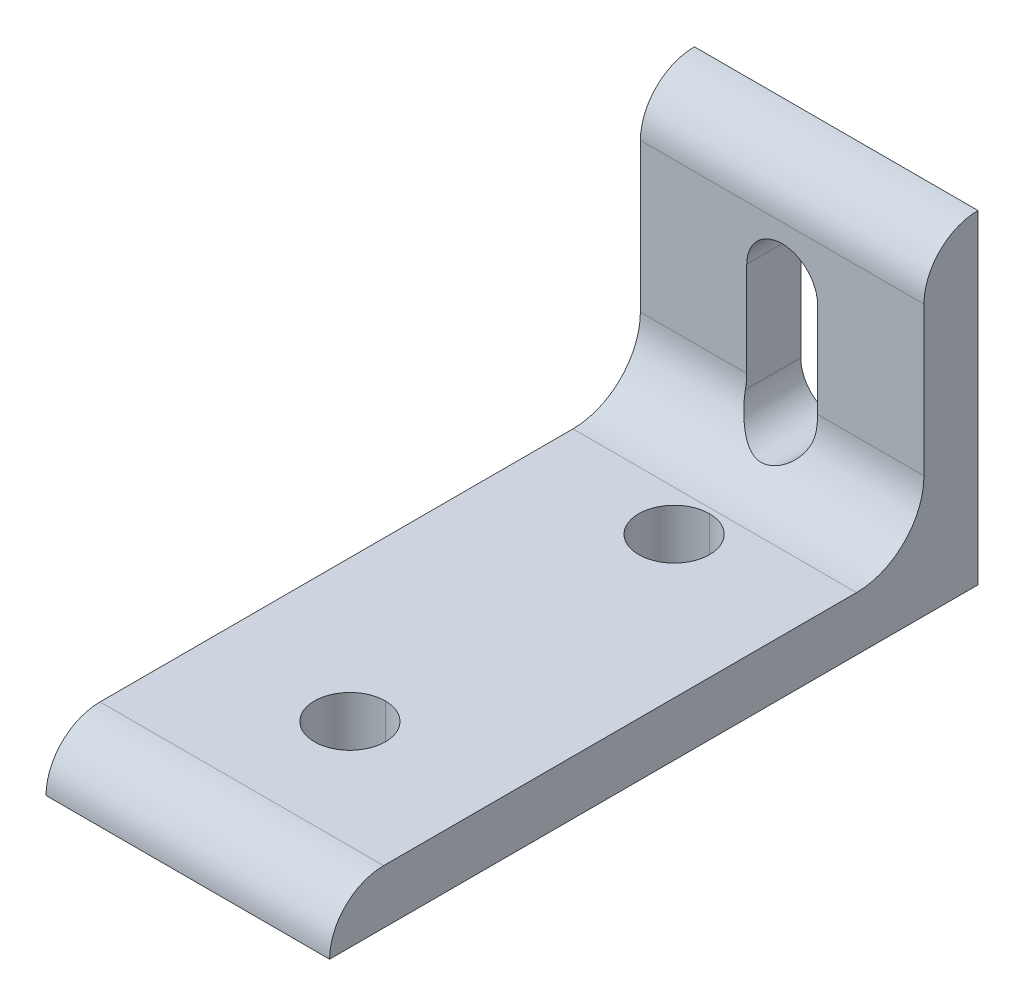
ISO-10303-21;
HEADER;
FILE_DESCRIPTION(('STEP AP214'),'2;1');
FILE_NAME('part.step','',(''),(''),'','','');
FILE_SCHEMA(('AUTOMOTIVE_DESIGN { 1 0 10303 214 1 1 1 1 }'));
ENDSEC;
DATA;
#1=APPLICATION_CONTEXT('core data for automotive mechanical design processes');
#2=APPLICATION_PROTOCOL_DEFINITION('international standard','automotive_design',2000,#1);
#3=PRODUCT_CONTEXT('',#1,'mechanical');
#4=PRODUCT('Part','Part','',(#3));
#5=PRODUCT_RELATED_PRODUCT_CATEGORY('part','',(#4));
#6=PRODUCT_DEFINITION_FORMATION('','',#4);
#7=PRODUCT_DEFINITION_CONTEXT('part definition',#1,'design');
#8=PRODUCT_DEFINITION('design','',#6,#7);
#9=PRODUCT_DEFINITION_SHAPE('','',#8);
#10=(LENGTH_UNIT() NAMED_UNIT(*) SI_UNIT(.MILLI.,.METRE.));
#11=(NAMED_UNIT(*) PLANE_ANGLE_UNIT() SI_UNIT($,.RADIAN.));
#12=(NAMED_UNIT(*) SI_UNIT($,.STERADIAN.) SOLID_ANGLE_UNIT());
#13=UNCERTAINTY_MEASURE_WITH_UNIT(LENGTH_MEASURE(1.E-05),#10,'distance_accuracy_value','');
#14=(GEOMETRIC_REPRESENTATION_CONTEXT(3) GLOBAL_UNCERTAINTY_ASSIGNED_CONTEXT((#13)) GLOBAL_UNIT_ASSIGNED_CONTEXT((#10,
#11,#12)) REPRESENTATION_CONTEXT('',''));
#15=CARTESIAN_POINT('',(0.,0.,0.));
#16=DIRECTION('',(0.,0.,1.));
#17=DIRECTION('',(1.,0.,0.));
#18=AXIS2_PLACEMENT_3D('',#15,#16,#17);
#19=CARTESIAN_POINT('',(16.6624,14.2748,14.2748));
#20=DIRECTION('',(-1.,0.,0.));
#21=DIRECTION('',(0.,0.707106781186548,0.707106781186548));
#22=AXIS2_PLACEMENT_3D('',#19,#20,#21);
#23=CYLINDRICAL_SURFACE('',#22,7.9248);
#24=CARTESIAN_POINT('',(4.1656,12.7,6.50804649547831));
#25=CARTESIAN_POINT('',(4.16559910068862,12.6483262510868,6.51852290068247));
#26=CARTESIAN_POINT('',(4.16460923845618,12.5967597649538,6.52951650766799));
#27=CARTESIAN_POINT('',(4.16070433576214,12.4937964106606,6.55254212415396));
#28=CARTESIAN_POINT('',(4.15778448578746,12.4424002894491,6.56457666236116));
#29=CARTESIAN_POINT('',(4.15006547902772,12.3398932292368,6.58965968324226));
#30=CARTESIAN_POINT('',(4.14526270378471,12.2887830326713,6.6027100791782));
#31=CARTESIAN_POINT('',(4.13382226612954,12.186959563482,6.62979143524392));
#32=CARTESIAN_POINT('',(4.12718226462334,12.1362468821698,6.64382362823445));
#33=CARTESIAN_POINT('',(4.1121120171003,12.0353285012999,6.67282785159898));
#34=CARTESIAN_POINT('',(4.10368077814917,11.9851230991784,6.68780039998305));
#35=CARTESIAN_POINT('',(4.08507272844787,11.8853265632392,6.7186370413421));
#36=CARTESIAN_POINT('',(4.07489631791151,11.8357352913747,6.73450092934986));
#37=CARTESIAN_POINT('',(4.05284185887812,11.7372716352314,6.76706459618152));
#38=CARTESIAN_POINT('',(4.04096563713014,11.6883985405308,6.78376346529353));
#39=CARTESIAN_POINT('',(4.01555812264469,11.5914718888298,6.81793466111083));
#40=CARTESIAN_POINT('',(4.00203010169491,11.5434169198518,6.83540541645101));
#41=CARTESIAN_POINT('',(3.97335543609489,11.4482260121035,6.87105025997871));
#42=CARTESIAN_POINT('',(3.95821353255274,11.4010878375251,6.88922219316665));
#43=CARTESIAN_POINT('',(3.92633012958023,11.3076555364116,6.92626045851652));
#44=CARTESIAN_POINT('',(3.90958922720121,11.2613611024608,6.94512652988853));
#45=CARTESIAN_POINT('',(3.874545258972,11.1695477047277,6.98354879843956));
#46=CARTESIAN_POINT('',(3.85623940489683,11.1240303059863,7.00310618937914));
#47=CARTESIAN_POINT('',(3.81811021919776,11.0338324168393,7.04285582753527));
#48=CARTESIAN_POINT('',(3.79828484226978,10.9891531589003,7.06304890808212));
#49=CARTESIAN_POINT('',(3.75716815330975,10.9006882759781,7.10401181625168));
#50=CARTESIAN_POINT('',(3.73587557524143,10.8569034661278,7.12478213250859));
#51=CARTESIAN_POINT('',(3.69187412500125,10.770281987965,7.16683775055717));
#52=CARTESIAN_POINT('',(3.66916477890621,10.7274456434865,7.18812322320068));
#53=CARTESIAN_POINT('',(3.62238002089509,10.6427725367516,7.23114426669175));
#54=CARTESIAN_POINT('',(3.59830493457038,10.6009355396032,7.25287972948388));
#55=CARTESIAN_POINT('',(3.54883839349804,10.5183098956977,7.29673272750984));
#56=CARTESIAN_POINT('',(3.52344806502744,10.4775203952949,7.318849925374));
#57=CARTESIAN_POINT('',(3.47140222787135,10.3970347361924,7.36339609373931));
#58=CARTESIAN_POINT('',(3.44474864062929,10.3573370535109,7.38582455623942));
#59=CARTESIAN_POINT('',(3.39022032802085,10.2790775590841,7.43092005267494));
#60=CARTESIAN_POINT('',(3.36234824187561,10.2405135681882,7.45358649734641));
#61=CARTESIAN_POINT('',(3.30535360370953,10.1644232387242,7.49916527845639));
#62=CARTESIAN_POINT('',(3.27623026332492,10.126897579586,7.52207776288898));
#63=CARTESIAN_POINT('',(3.21671980689949,10.0528521110899,7.56812306899885));
#64=CARTESIAN_POINT('',(3.18633033124268,10.0163344118377,7.59125623389117));
#65=CARTESIAN_POINT('',(3.12431600896386,9.94435081592525,7.63766948892534));
#66=CARTESIAN_POINT('',(3.09268951300134,9.90888644270178,7.66094973794245));
#67=CARTESIAN_POINT('',(3.02823169197178,9.83905120058719,7.70758202311579));
#68=CARTESIAN_POINT('',(2.995399389486,9.80468126293414,7.7309341027945));
#69=CARTESIAN_POINT('',(2.92855996665256,9.73707391479773,7.77763250954442));
#70=CARTESIAN_POINT('',(2.89455249636072,9.70383684761878,7.80097883278039));
#71=CARTESIAN_POINT('',(2.82539296749285,9.63853120752479,7.84758632215062));
#72=CARTESIAN_POINT('',(2.79024114025831,9.60646240117966,7.87084750445204));
#73=CARTESIAN_POINT('',(2.7188230361711,9.5435264998941,7.91720355548552));
#74=CARTESIAN_POINT('',(2.68255752252418,9.5126586134597,7.94029852529238));
#75=CARTESIAN_POINT('',(2.6089425952563,9.45215470914943,7.98623986070978));
#76=CARTESIAN_POINT('',(2.57159442301909,9.42251736835589,8.00908647272543));
#77=CARTESIAN_POINT('',(2.49584346311943,9.36450328045691,8.05444670963974));
#78=CARTESIAN_POINT('',(2.45744233882141,9.33612471174852,8.0769607820265));
#79=CARTESIAN_POINT('',(2.37961716666478,9.28064831258157,8.1215757643151));
#80=CARTESIAN_POINT('',(2.34019506153033,9.25354829206915,8.1436773383844));
#81=CARTESIAN_POINT('',(2.26020132275405,9.20057245436101,8.18744817404037));
#82=CARTESIAN_POINT('',(2.21962809450969,9.17469848267562,8.20911675718393));
#83=CARTESIAN_POINT('',(2.13728802570806,9.12418820790345,8.25194748304888));
#84=CARTESIAN_POINT('',(2.0955184407531,9.09955517996449,8.2731082155752));
#85=CARTESIAN_POINT('',(2.01083639254707,9.05159684581087,8.31479876507631));
#86=CARTESIAN_POINT('',(1.96792243834031,9.02827338223667,8.33532767556159));
#87=CARTESIAN_POINT('',(1.88100062797943,8.9830023088737,8.37562624809991));
#88=CARTESIAN_POINT('',(1.83699236616183,8.96105522025898,8.39539562146432));
#89=CARTESIAN_POINT('',(1.74793151905121,8.91860142434246,8.43404529460075));
#90=CARTESIAN_POINT('',(1.70287942766104,8.89809405360948,8.45292600253589));
#91=CARTESIAN_POINT('',(1.61178079043352,8.85858124938866,8.4896676372607));
#92=CARTESIAN_POINT('',(1.56573542710861,8.83957414323546,8.50752969341003));
#93=CARTESIAN_POINT('',(1.47269942511129,8.8031226664084,8.54210148239709));
#94=CARTESIAN_POINT('',(1.42571042390053,8.78567583419806,8.55881302038412));
#95=CARTESIAN_POINT('',(1.33084001601571,8.75239891861909,8.59095663470236));
#96=CARTESIAN_POINT('',(1.28296044109199,8.73656587492093,8.60639104363444));
#97=CARTESIAN_POINT('',(1.18626701188708,8.70656395118639,8.63585999931674));
#98=CARTESIAN_POINT('',(1.13745334326693,8.69239474435936,8.64989482087499));
#99=CARTESIAN_POINT('',(1.03877037576843,8.66576158539076,8.67645214157442));
#100=CARTESIAN_POINT('',(0.988898111408036,8.65330344800409,8.68896946766798));
#101=CARTESIAN_POINT('',(0.888272406566362,8.63013146038122,8.71238653212755));
#102=CARTESIAN_POINT('',(0.837517510437975,8.61942086984744,8.72328324428546));
#103=CARTESIAN_POINT('',(0.735299141684097,8.5998114977886,8.74333026850751));
#104=CARTESIAN_POINT('',(0.683835454138323,8.59091327932723,8.75248003778026));
#105=CARTESIAN_POINT('',(0.580376114788418,8.57499293169131,8.76891358589675));
#106=CARTESIAN_POINT('',(0.528381051430956,8.56796892064611,8.77619923617696));
#107=CARTESIAN_POINT('',(0.424035364870416,8.5558659359328,8.78878829695607));
#108=CARTESIAN_POINT('',(0.371685700038057,8.55078296758398,8.79409577799623));
#109=CARTESIAN_POINT('',(0.266797454367452,8.54263689718797,8.80261616136688));
#110=CARTESIAN_POINT('',(0.214259744020138,8.5395684686319,8.8058345869701));
#111=CARTESIAN_POINT('',(0.108930158217709,8.53551763121947,8.81008575263676));
#112=CARTESIAN_POINT('',(0.0561380086822987,8.53453861508933,8.81111493786739));
#113=CARTESIAN_POINT('',(-0.0495949605609174,8.53459357445839,8.81105723065727));
#114=CARTESIAN_POINT('',(-0.102535766697312,8.53563340524478,8.80996418307764));
#115=CARTESIAN_POINT('',(-0.208347322249661,8.53968773054371,8.80570949989556));
#116=CARTESIAN_POINT('',(-0.261217801206745,8.54270556606149,8.8025443643847));
#117=CARTESIAN_POINT('',(-0.366668340180755,8.55068067647249,8.79420274227102));
#118=CARTESIAN_POINT('',(-0.419248307137458,8.5556385399963,8.78902564521527));
#119=CARTESIAN_POINT('',(-0.523896820823398,8.56746631049866,8.77672126223338));
#120=CARTESIAN_POINT('',(-0.575965912137539,8.57433388286567,8.76959635767271));
#121=CARTESIAN_POINT('',(-0.679373069825542,8.58995638074271,8.75346554710628));
#122=CARTESIAN_POINT('',(-0.73071278606652,8.59870591850158,8.74446501295881));
#123=CARTESIAN_POINT('',(-0.832523307863322,8.61809927353439,8.72463039526984));
#124=CARTESIAN_POINT('',(-0.882996099642055,8.6287378650111,8.71380137393298));
#125=CARTESIAN_POINT('',(-0.983236251490251,8.65181563659448,8.69046726358006));
#126=CARTESIAN_POINT('',(-1.03300213460107,8.66425810973476,8.67795911242894));
#127=CARTESIAN_POINT('',(-1.13176093391308,8.69088148485623,8.65139684423846));
#128=CARTESIAN_POINT('',(-1.18075210284465,8.70506581787219,8.63733968180343));
#129=CARTESIAN_POINT('',(-1.27787732221295,8.73510058095985,8.60782290529264));
#130=CARTESIAN_POINT('',(-1.32600998096485,8.75095347143239,8.59236122489056));
#131=CARTESIAN_POINT('',(-1.42133317332004,8.784255474997,8.56017731703002));
#132=CARTESIAN_POINT('',(-1.46852300010586,8.80170573464978,8.54345418566561));
#133=CARTESIAN_POINT('',(-1.5618748660428,8.83813173016181,8.50888955095182));
#134=CARTESIAN_POINT('',(-1.60803719294482,8.85710703189165,8.49104836619185));
#135=CARTESIAN_POINT('',(-1.69924978383119,8.89650892563569,8.45439079745789));
#136=CARTESIAN_POINT('',(-1.7443016111633,8.91693329938536,8.43557591549413));
#137=CARTESIAN_POINT('',(-1.83320209487406,8.95916388711591,8.39710649246978));
#138=CARTESIAN_POINT('',(-1.87705386222272,8.9809659209396,8.3774545453187));
#139=CARTESIAN_POINT('',(-1.96363094326651,9.0259269907246,8.33740222083245));
#140=CARTESIAN_POINT('',(-2.00635749621461,9.04908443479573,8.31700273159426));
#141=CARTESIAN_POINT('',(-2.09082216870558,9.09676541372993,8.27551556129219));
#142=CARTESIAN_POINT('',(-2.13255831558851,9.12129139417706,8.25442667805237));
#143=CARTESIAN_POINT('',(-2.21500742924451,9.17168666266671,8.21165038874408));
#144=CARTESIAN_POINT('',(-2.25571864148252,9.19755804880204,8.18996207416265));
#145=CARTESIAN_POINT('',(-2.33609097852183,9.25061071371635,8.14608368816412));
#146=CARTESIAN_POINT('',(-2.37575069278334,9.27779362647569,8.1238930101381));
#147=CARTESIAN_POINT('',(-2.45399084888472,9.33343582933559,8.07910376924644));
#148=CARTESIAN_POINT('',(-2.49257032120512,9.36189620988127,8.05650486814539));
#149=CARTESIAN_POINT('',(-2.56862128857915,9.42005656316795,8.01099243198638));
#150=CARTESIAN_POINT('',(-2.60609234700774,9.44975701357257,7.98807877801187));
#151=CARTESIAN_POINT('',(-2.67989753257117,9.51035799937778,7.94202844917097));
#152=CARTESIAN_POINT('',(-2.71623183881969,9.54125834397847,7.91889181019861));
#153=CARTESIAN_POINT('',(-2.78773452340449,9.60421647975658,7.87248535783819));
#154=CARTESIAN_POINT('',(-2.82290377234515,9.63627336747611,7.84921565985857));
#155=CARTESIAN_POINT('',(-2.892047256023,9.70149873925947,7.80263077496292));
#156=CARTESIAN_POINT('',(-2.92602312273601,9.73466557365784,7.77931570017134));
#157=CARTESIAN_POINT('',(-2.99275068923808,9.80206156533931,7.73272536576135));
#158=CARTESIAN_POINT('',(-3.02550484784911,9.83628830327493,7.70945012741818));
#159=CARTESIAN_POINT('',(-3.08979988619321,9.90579498105089,7.66299276389463));
#160=CARTESIAN_POINT('',(-3.12134267053342,9.94107309850031,7.63981054856553));
#161=CARTESIAN_POINT('',(-3.18330262007488,10.012807833151,7.59350491461863));
#162=CARTESIAN_POINT('',(-3.21371719617037,10.0492668399351,7.57038173249746));
#163=CARTESIAN_POINT('',(-3.27338971954744,10.1233433945556,7.52426146205921));
#164=CARTESIAN_POINT('',(-3.30264527416552,10.160963080098,7.50126471121694));
#165=CARTESIAN_POINT('',(-3.35995127797596,10.2373272227098,7.4554706023357));
#166=CARTESIAN_POINT('',(-3.38800001973318,10.2760731513248,7.43267356094008));
#167=CARTESIAN_POINT('',(-3.44284497785957,10.3546524006964,7.38735078507675));
#168=CARTESIAN_POINT('',(-3.46964018778418,10.3944865558718,7.36482527903747));
#169=CARTESIAN_POINT('',(-3.52193035002835,10.4752021348307,7.32011524294332));
#170=CARTESIAN_POINT('',(-3.54742500761759,10.5160837928729,7.2979307909667));
#171=CARTESIAN_POINT('',(-3.59706643113914,10.5988512468828,7.25397021637245));
#172=CARTESIAN_POINT('',(-3.6212136217272,10.64073672048,7.23219396656266));
#173=CARTESIAN_POINT('',(-3.66811232456724,10.725465792904,7.18911453336947));
#174=CARTESIAN_POINT('',(-3.69086498433196,10.7683085632834,7.16781097049451));
#175=CARTESIAN_POINT('',(-3.73492729961112,10.8549031691655,7.12573888470233));
#176=CARTESIAN_POINT('',(-3.75623882304035,10.898653727988,7.10496969168461));
#177=CARTESIAN_POINT('',(-3.79736982841855,10.9870125376726,7.06402505845858));
#178=CARTESIAN_POINT('',(-3.8171918927149,11.0316191274898,7.04384862936437));
#179=CARTESIAN_POINT('',(-3.85530326820386,11.1216384667682,7.00414373567786));
#180=CARTESIAN_POINT('',(-3.87359569423146,11.1670493379022,6.98461400576322));
#181=CARTESIAN_POINT('',(-3.90867839410784,11.2588860571683,6.94614363278004));
#182=CARTESIAN_POINT('',(-3.92546367421725,11.3053146880127,6.92720507457009));
#183=CARTESIAN_POINT('',(-3.95751892084027,11.3991876079824,6.88995951795579));
#184=CARTESIAN_POINT('',(-3.97278231183022,11.4466353116678,6.87165546568707));
#185=CARTESIAN_POINT('',(-4.00170506907039,11.542360346535,6.8357917417685));
#186=CARTESIAN_POINT('',(-4.01536262872059,11.5906385433819,6.81823292244524));
#187=CARTESIAN_POINT('',(-4.04098275142792,11.6878321925141,6.78395872525931));
#188=CARTESIAN_POINT('',(-4.05294840675306,11.7367462990235,6.76724184557835));
#189=CARTESIAN_POINT('',(-4.07509502057221,11.8350151636694,6.73473562739216));
#190=CARTESIAN_POINT('',(-4.0852841291831,11.8843667560211,6.71894228657641));
#191=CARTESIAN_POINT('',(-4.10386492217368,11.9837334143741,6.68822133390538));
#192=CARTESIAN_POINT('',(-4.11225469792912,12.0337491257185,6.67329465346728));
#193=CARTESIAN_POINT('',(-4.12726784195247,12.1345435147853,6.64430068402028));
#194=CARTESIAN_POINT('',(-4.13388299884585,12.1853246286432,6.63023761454882));
#195=CARTESIAN_POINT('',(-4.14529129619122,12.2874202113356,6.6030615210002));
#196=CARTESIAN_POINT('',(-4.15008189646109,12.3387353223104,6.58994984186169));
#197=CARTESIAN_POINT('',(-4.15778729975934,12.4416637264511,6.56475021167598));
#198=CARTESIAN_POINT('',(-4.16070529411383,12.4932763602554,6.55266054959337));
#199=CARTESIAN_POINT('',(-4.16460485017023,12.5965576151821,6.52955960645114));
#200=CARTESIAN_POINT('',(-4.16559552197688,12.6482248121769,6.51854348701891));
#201=CARTESIAN_POINT('',(-4.16560000000001,12.7,6.50804649547831));
#202=B_SPLINE_CURVE_WITH_KNOTS('',3,(#24,#25,#26,#27,#28,#29,#30,#31,#32,#33,#34,#35,#36,#37,
#38,#39,#40,#41,#42,#43,#44,#45,#46,#47,#48,#49,#50,#51,#52,#53,#54,#55,#56,#57,#58,#59,#60,#61,
#62,#63,#64,#65,#66,#67,#68,#69,#70,#71,#72,#73,#74,#75,#76,#77,#78,#79,#80,#81,#82,#83,#84,#85,
#86,#87,#88,#89,#90,#91,#92,#93,#94,#95,#96,#97,#98,#99,#100,#101,#102,#103,#104,#105,#106,#107,
#108,#109,#110,#111,#112,#113,#114,#115,#116,#117,#118,#119,#120,#121,#122,#123,#124,#125,#126,
#127,#128,#129,#130,#131,#132,#133,#134,#135,#136,#137,#138,#139,#140,#141,#142,#143,#144,#145,
#146,#147,#148,#149,#150,#151,#152,#153,#154,#155,#156,#157,#158,#159,#160,#161,#162,#163,#164,
#165,#166,#167,#168,#169,#170,#171,#172,#173,#174,#175,#176,#177,#178,#179,#180,#181,#182,#183,
#184,#185,#186,#187,#188,#189,#190,#191,#192,#193,#194,#195,#196,#197,#198,#199,#200,#201),
.UNSPECIFIED.,.F.,.F.,(4,2,2,2,2,2,2,2,2,2,2,2,2,2,2,2,2,2,2,2,2,2,2,2,2,2,2,2,2,2,2,2,2,2,2,2,
2,2,2,2,2,2,2,2,2,2,2,2,2,2,2,2,2,2,2,2,2,2,2,2,2,2,2,2,2,2,2,2,2,2,2,2,2,2,2,2,2,2,2,2,2,2,2,2,
2,2,2,2,4),(0.,0.158159857377764,0.316715341244292,0.47557703003365,0.634641914247379,
0.793795203831424,0.952912044063349,1.11185915135172,1.27049638278965,1.42867980039147,
1.58680438296594,1.74521680916305,1.90384633791218,2.06261450367514,2.22143606675108,
2.38021992472583,2.53886998998495,2.69728603896792,2.85537449306708,3.01356405636863,
3.17206291393042,3.33078083059862,3.48963037268421,3.64852763202833,3.8073929660148,
3.96615175835823,4.12473520499899,4.28308112883479,4.44114516277461,4.59944001957163,
4.75813284357166,4.91704363382925,5.07601423791223,5.23491109985617,5.39362822689973,
5.55209036892943,5.71025638907811,5.86839129203325,6.02705095069345,6.18600325531587,
6.34500486781047,6.5038462226127,6.66235889597774,6.82045075050267,6.97879911521712,
7.13760742581177,7.29668466977267,7.45581021738039,7.61474208342554,7.77322487032722,
7.93127588019935,8.08961913683947,8.24827945010231,8.40717708640052,8.5661896843178,
8.72515717581733,8.88388635998876,9.04215511827692,9.20024158580343,9.3586202135858,
9.51725369835119,9.67609019640848,9.83506495608705,9.99410152677192,10.1531129111616,
10.3120026613976,10.4706659217331,10.6289904220071,10.7870548512422,10.9454620274278,
11.1041807778576,11.2631171620282,11.4221790378355,11.5812768014532,11.7403241387228,
11.8992387938155,12.0579433605584,12.2163661013812,12.3744579609433,12.5330556693454,
12.6923113557742,12.8517445283527,13.0108824327876,13.1692698799269,13.3278245129835,
13.487100615319,13.6465976612406,13.8058221626994,13.9642921924172),.UNSPECIFIED.);
#203=CARTESIAN_POINT('',(4.1656,12.7,6.50804649547831));
#204=VERTEX_POINT('',#203);
#205=CARTESIAN_POINT('',(-4.1656,12.7,6.50804649547831));
#206=VERTEX_POINT('',#205);
#207=EDGE_CURVE('E11',#204,#206,#202,.T.);
#208=ORIENTED_EDGE('',*,*,#207,.T.);
#209=CARTESIAN_POINT('',(-4.1656,14.2748,14.2748));
#210=DIRECTION('',(1.,0.,0.));
#211=DIRECTION('',(0.,0.,-1.));
#212=AXIS2_PLACEMENT_3D('',#209,#210,#211);
#213=CIRCLE('',#212,7.9248);
#214=CARTESIAN_POINT('',(-4.1656,14.2748,6.35));
#215=VERTEX_POINT('',#214);
#216=EDGE_CURVE('E25',#206,#215,#213,.T.);
#217=ORIENTED_EDGE('',*,*,#216,.T.);
#218=DIRECTION('',(-1.,0.,0.));
#219=VECTOR('',#218,1.);
#220=CARTESIAN_POINT('',(16.6624,14.2748,6.35));
#221=LINE('',#220,#219);
#222=CARTESIAN_POINT('',(-16.6624,14.2748,6.35));
#223=VERTEX_POINT('',#222);
#224=EDGE_CURVE('E349',#215,#223,#221,.T.);
#225=ORIENTED_EDGE('',*,*,#224,.T.);
#226=CARTESIAN_POINT('',(-16.6624,14.2748,14.2748));
#227=DIRECTION('',(1.,0.,0.));
#228=DIRECTION('',(0.,0.,-1.));
#229=AXIS2_PLACEMENT_3D('',#226,#227,#228);
#230=CIRCLE('',#229,7.9248);
#231=CARTESIAN_POINT('',(-16.6624,6.35,14.2748));
#232=VERTEX_POINT('',#231);
#233=EDGE_CURVE('E153',#232,#223,#230,.T.);
#234=ORIENTED_EDGE('',*,*,#233,.F.);
#235=DIRECTION('',(-1.,0.,0.));
#236=VECTOR('',#235,1.);
#237=CARTESIAN_POINT('',(16.6624,6.35,14.2748));
#238=LINE('',#237,#236);
#239=CARTESIAN_POINT('',(16.6624,6.35,14.2748));
#240=VERTEX_POINT('',#239);
#241=EDGE_CURVE('E341',#240,#232,#238,.T.);
#242=ORIENTED_EDGE('',*,*,#241,.F.);
#243=CARTESIAN_POINT('',(16.6624,14.2748,14.2748));
#244=DIRECTION('',(1.,0.,0.));
#245=DIRECTION('',(0.,0.,-1.));
#246=AXIS2_PLACEMENT_3D('',#243,#244,#245);
#247=CIRCLE('',#246,7.9248);
#248=CARTESIAN_POINT('',(16.6624,14.2748,6.35));
#249=VERTEX_POINT('',#248);
#250=EDGE_CURVE('E337',#240,#249,#247,.T.);
#251=ORIENTED_EDGE('',*,*,#250,.T.);
#252=DIRECTION('',(-1.,0.,0.));
#253=VECTOR('',#252,1.);
#254=CARTESIAN_POINT('',(16.6624,14.2748,6.35));
#255=LINE('',#254,#253);
#256=CARTESIAN_POINT('',(4.1656,14.2748,6.35));
#257=VERTEX_POINT('',#256);
#258=EDGE_CURVE('E333',#249,#257,#255,.T.);
#259=ORIENTED_EDGE('',*,*,#258,.T.);
#260=CARTESIAN_POINT('',(4.1656,14.2748,14.2748));
#261=DIRECTION('',(-1.,0.,0.));
#262=DIRECTION('',(0.,0.,1.));
#263=AXIS2_PLACEMENT_3D('',#260,#261,#262);
#264=CIRCLE('',#263,7.9248);
#265=EDGE_CURVE('E316',#257,#204,#264,.T.);
#266=ORIENTED_EDGE('',*,*,#265,.T.);
#267=EDGE_LOOP('',(#208,#217,#225,#234,#242,#251,#259,#266));
#268=FACE_BOUND('',#267,.T.);
#269=ADVANCED_FACE('F17',(#268),#23,.F.);
#270=CARTESIAN_POINT('',(4.1656,12.7,12.7));
#271=DIRECTION('',(-1.,0.,0.));
#272=DIRECTION('',(0.,0.,1.));
#273=AXIS2_PLACEMENT_3D('',#270,#271,#272);
#274=PLANE('',#273);
#275=DIRECTION('',(0.,1.,0.));
#276=VECTOR('',#275,1.);
#277=CARTESIAN_POINT('',(4.1656,31.75,6.35));
#278=LINE('',#277,#276);
#279=CARTESIAN_POINT('',(4.1656,25.4,6.35));
#280=VERTEX_POINT('',#279);
#281=EDGE_CURVE('E310',#257,#280,#278,.T.);
#282=ORIENTED_EDGE('',*,*,#281,.T.);
#283=DIRECTION('',(0.,0.,-1.));
#284=VECTOR('',#283,1.);
#285=CARTESIAN_POINT('',(4.1656,25.4,12.7));
#286=LINE('',#285,#284);
#287=CARTESIAN_POINT('',(4.1656,25.4,0.));
#288=VERTEX_POINT('',#287);
#289=EDGE_CURVE('E313',#280,#288,#286,.T.);
#290=ORIENTED_EDGE('',*,*,#289,.T.);
#291=DIRECTION('',(0.,1.,0.));
#292=VECTOR('',#291,1.);
#293=CARTESIAN_POINT('',(4.1656,12.7,0.));
#294=LINE('',#293,#292);
#295=CARTESIAN_POINT('',(4.1656,12.7,0.));
#296=VERTEX_POINT('',#295);
#297=EDGE_CURVE('E321',#296,#288,#294,.T.);
#298=ORIENTED_EDGE('',*,*,#297,.F.);
#299=DIRECTION('',(0.,0.,-1.));
#300=VECTOR('',#299,1.);
#301=CARTESIAN_POINT('',(4.1656,12.7,12.7));
#302=LINE('',#301,#300);
#303=EDGE_CURVE('E323',#204,#296,#302,.T.);
#304=ORIENTED_EDGE('',*,*,#303,.F.);
#305=ORIENTED_EDGE('',*,*,#265,.F.);
#306=EDGE_LOOP('',(#282,#290,#298,#304,#305));
#307=FACE_BOUND('',#306,.T.);
#308=ADVANCED_FACE('F299',(#307),#274,.T.);
#309=CARTESIAN_POINT('',(0.,12.7,12.7));
#310=DIRECTION('',(0.,0.,-1.));
#311=DIRECTION('',(0.,1.,0.));
#312=AXIS2_PLACEMENT_3D('',#309,#310,#311);
#313=CYLINDRICAL_SURFACE('',#312,4.1656);
#314=ORIENTED_EDGE('',*,*,#303,.T.);
#315=CARTESIAN_POINT('',(0.,12.7,0.));
#316=DIRECTION('',(0.,0.,1.));
#317=DIRECTION('',(1.,0.,0.));
#318=AXIS2_PLACEMENT_3D('',#315,#316,#317);
#319=CIRCLE('',#318,4.1656);
#320=CARTESIAN_POINT('',(-4.1656,12.7,0.));
#321=VERTEX_POINT('',#320);
#322=EDGE_CURVE('E377',#321,#296,#319,.T.);
#323=ORIENTED_EDGE('',*,*,#322,.F.);
#324=DIRECTION('',(0.,0.,-1.));
#325=VECTOR('',#324,1.);
#326=CARTESIAN_POINT('',(-4.1656,12.7,12.7));
#327=LINE('',#326,#325);
#328=EDGE_CURVE('E281',#206,#321,#327,.T.);
#329=ORIENTED_EDGE('',*,*,#328,.F.);
#330=ORIENTED_EDGE('',*,*,#207,.F.);
#331=EDGE_LOOP('',(#314,#323,#329,#330));
#332=FACE_BOUND('',#331,.T.);
#333=ADVANCED_FACE('F289',(#332),#313,.F.);
#334=CARTESIAN_POINT('',(-4.1656,25.4,12.7));
#335=DIRECTION('',(1.,0.,0.));
#336=DIRECTION('',(0.,0.,-1.));
#337=AXIS2_PLACEMENT_3D('',#334,#335,#336);
#338=PLANE('',#337);
#339=DIRECTION('',(0.,-1.,0.));
#340=VECTOR('',#339,1.);
#341=CARTESIAN_POINT('',(-4.1656,31.75,6.35));
#342=LINE('',#341,#340);
#343=CARTESIAN_POINT('',(-4.1656,25.4,6.35));
#344=VERTEX_POINT('',#343);
#345=EDGE_CURVE('E277',#344,#215,#342,.T.);
#346=ORIENTED_EDGE('',*,*,#345,.T.);
#347=ORIENTED_EDGE('',*,*,#216,.F.);
#348=ORIENTED_EDGE('',*,*,#328,.T.);
#349=DIRECTION('',(0.,-1.,0.));
#350=VECTOR('',#349,1.);
#351=CARTESIAN_POINT('',(-4.1656,25.4,0.));
#352=LINE('',#351,#350);
#353=CARTESIAN_POINT('',(-4.1656,25.4,0.));
#354=VERTEX_POINT('',#353);
#355=EDGE_CURVE('E272',#354,#321,#352,.T.);
#356=ORIENTED_EDGE('',*,*,#355,.F.);
#357=DIRECTION('',(0.,0.,-1.));
#358=VECTOR('',#357,1.);
#359=CARTESIAN_POINT('',(-4.1656,25.4,12.7));
#360=LINE('',#359,#358);
#361=EDGE_CURVE('E267',#344,#354,#360,.T.);
#362=ORIENTED_EDGE('',*,*,#361,.F.);
#363=EDGE_LOOP('',(#346,#347,#348,#356,#362));
#364=FACE_BOUND('',#363,.T.);
#365=ADVANCED_FACE('F298',(#364),#338,.T.);
#366=CARTESIAN_POINT('',(0.,25.4,12.7));
#367=DIRECTION('',(0.,0.,-1.));
#368=DIRECTION('',(0.,-1.,0.));
#369=AXIS2_PLACEMENT_3D('',#366,#367,#368);
#370=CYLINDRICAL_SURFACE('',#369,4.1656);
#371=CARTESIAN_POINT('',(0.,25.4,6.35));
#372=DIRECTION('',(0.,0.,1.));
#373=DIRECTION('',(-1.,0.,0.));
#374=AXIS2_PLACEMENT_3D('',#371,#372,#373);
#375=CIRCLE('',#374,4.1656);
#376=EDGE_CURVE('E262',#280,#344,#375,.T.);
#377=ORIENTED_EDGE('',*,*,#376,.T.);
#378=ORIENTED_EDGE('',*,*,#361,.T.);
#379=CARTESIAN_POINT('',(0.,25.4,0.));
#380=DIRECTION('',(0.,0.,1.));
#381=DIRECTION('',(1.,0.,0.));
#382=AXIS2_PLACEMENT_3D('',#379,#380,#381);
#383=CIRCLE('',#382,4.1656);
#384=EDGE_CURVE('E257',#288,#354,#383,.T.);
#385=ORIENTED_EDGE('',*,*,#384,.F.);
#386=ORIENTED_EDGE('',*,*,#289,.F.);
#387=EDGE_LOOP('',(#377,#378,#385,#386));
#388=FACE_BOUND('',#387,.T.);
#389=ADVANCED_FACE('F319',(#388),#370,.F.);
#390=CARTESIAN_POINT('',(16.6624,0.,0.));
#391=DIRECTION('',(0.,0.,1.));
#392=DIRECTION('',(1.,0.,0.));
#393=AXIS2_PLACEMENT_3D('',#390,#391,#392);
#394=PLANE('',#393);
#395=ORIENTED_EDGE('',*,*,#355,.T.);
#396=ORIENTED_EDGE('',*,*,#322,.T.);
#397=ORIENTED_EDGE('',*,*,#297,.T.);
#398=ORIENTED_EDGE('',*,*,#384,.T.);
#399=EDGE_LOOP('',(#395,#396,#397,#398));
#400=FACE_BOUND('',#399,.T.);
#401=DIRECTION('',(0.,1.,0.));
#402=VECTOR('',#401,1.);
#403=CARTESIAN_POINT('',(-16.6624,0.,0.));
#404=LINE('',#403,#402);
#405=CARTESIAN_POINT('',(-16.6624,0.,0.));
#406=VERTEX_POINT('',#405);
#407=CARTESIAN_POINT('',(-16.6624,38.1,0.));
#408=VERTEX_POINT('',#407);
#409=EDGE_CURVE('E253',#406,#408,#404,.T.);
#410=ORIENTED_EDGE('',*,*,#409,.T.);
#411=DIRECTION('',(-1.,0.,0.));
#412=VECTOR('',#411,1.);
#413=CARTESIAN_POINT('',(16.6624,38.1,0.));
#414=LINE('',#413,#412);
#415=CARTESIAN_POINT('',(16.6624,38.1,0.));
#416=VERTEX_POINT('',#415);
#417=EDGE_CURVE('E145',#416,#408,#414,.T.);
#418=ORIENTED_EDGE('',*,*,#417,.F.);
#419=DIRECTION('',(0.,1.,0.));
#420=VECTOR('',#419,1.);
#421=CARTESIAN_POINT('',(16.6624,0.,0.));
#422=LINE('',#421,#420);
#423=CARTESIAN_POINT('',(16.6624,0.,0.));
#424=VERTEX_POINT('',#423);
#425=EDGE_CURVE('E245',#424,#416,#422,.T.);
#426=ORIENTED_EDGE('',*,*,#425,.F.);
#427=DIRECTION('',(-1.,0.,0.));
#428=VECTOR('',#427,1.);
#429=CARTESIAN_POINT('',(16.6624,0.,0.));
#430=LINE('',#429,#428);
#431=EDGE_CURVE('E241',#424,#406,#430,.T.);
#432=ORIENTED_EDGE('',*,*,#431,.T.);
#433=EDGE_LOOP('',(#410,#418,#426,#432));
#434=FACE_BOUND('',#433,.T.);
#435=ADVANCED_FACE('F382',(#400,#434),#394,.F.);
#436=CARTESIAN_POINT('',(16.6624,0.,76.2));
#437=DIRECTION('',(0.,1.,0.));
#438=DIRECTION('',(0.,0.,1.));
#439=AXIS2_PLACEMENT_3D('',#436,#437,#438);
#440=PLANE('',#439);
#441=CARTESIAN_POINT('',(0.,0.,57.15));
#442=DIRECTION('',(0.,1.,0.));
#443=DIRECTION('',(1.,0.,0.));
#444=AXIS2_PLACEMENT_3D('',#441,#442,#443);
#445=CIRCLE('',#444,4.1656);
#446=CARTESIAN_POINT('',(0.,0.,52.9844));
#447=VERTEX_POINT('',#446);
#448=CARTESIAN_POINT('',(0.,0.,61.3156));
#449=VERTEX_POINT('',#448);
#450=EDGE_CURVE('E237',#447,#449,#445,.T.);
#451=ORIENTED_EDGE('',*,*,#450,.T.);
#452=CARTESIAN_POINT('',(0.,0.,57.15));
#453=DIRECTION('',(0.,1.,0.));
#454=DIRECTION('',(0.,0.,1.));
#455=AXIS2_PLACEMENT_3D('',#452,#453,#454);
#456=CIRCLE('',#455,4.1656);
#457=EDGE_CURVE('E233',#449,#447,#456,.T.);
#458=ORIENTED_EDGE('',*,*,#457,.T.);
#459=EDGE_LOOP('',(#451,#458));
#460=FACE_BOUND('',#459,.T.);
#461=CARTESIAN_POINT('',(0.,0.,19.05));
#462=DIRECTION('',(0.,1.,0.));
#463=DIRECTION('',(1.,0.,0.));
#464=AXIS2_PLACEMENT_3D('',#461,#462,#463);
#465=CIRCLE('',#464,4.1656);
#466=CARTESIAN_POINT('',(0.,0.,14.8844));
#467=VERTEX_POINT('',#466);
#468=CARTESIAN_POINT('',(0.,0.,23.2156));
#469=VERTEX_POINT('',#468);
#470=EDGE_CURVE('E229',#467,#469,#465,.T.);
#471=ORIENTED_EDGE('',*,*,#470,.T.);
#472=CARTESIAN_POINT('',(0.,0.,19.05));
#473=DIRECTION('',(0.,1.,0.));
#474=DIRECTION('',(0.,0.,1.));
#475=AXIS2_PLACEMENT_3D('',#472,#473,#474);
#476=CIRCLE('',#475,4.1656);
#477=EDGE_CURVE('E225',#469,#467,#476,.T.);
#478=ORIENTED_EDGE('',*,*,#477,.T.);
#479=EDGE_LOOP('',(#471,#478));
#480=FACE_BOUND('',#479,.T.);
#481=DIRECTION('',(0.,0.,-1.));
#482=VECTOR('',#481,1.);
#483=CARTESIAN_POINT('',(-16.6624,0.,76.2));
#484=LINE('',#483,#482);
#485=CARTESIAN_POINT('',(-16.6624,0.,76.2));
#486=VERTEX_POINT('',#485);
#487=EDGE_CURVE('E220',#486,#406,#484,.T.);
#488=ORIENTED_EDGE('',*,*,#487,.T.);
#489=ORIENTED_EDGE('',*,*,#431,.F.);
#490=DIRECTION('',(0.,0.,-1.));
#491=VECTOR('',#490,1.);
#492=CARTESIAN_POINT('',(16.6624,0.,76.2));
#493=LINE('',#492,#491);
#494=CARTESIAN_POINT('',(16.6624,0.,76.2));
#495=VERTEX_POINT('',#494);
#496=EDGE_CURVE('E215',#495,#424,#493,.T.);
#497=ORIENTED_EDGE('',*,*,#496,.F.);
#498=DIRECTION('',(-1.,0.,0.));
#499=VECTOR('',#498,1.);
#500=CARTESIAN_POINT('',(16.6624,0.,76.2));
#501=LINE('',#500,#499);
#502=EDGE_CURVE('E211',#495,#486,#501,.T.);
#503=ORIENTED_EDGE('',*,*,#502,.T.);
#504=EDGE_LOOP('',(#488,#489,#497,#503));
#505=FACE_BOUND('',#504,.T.);
#506=ADVANCED_FACE('F392',(#460,#480,#505),#440,.F.);
#507=CARTESIAN_POINT('',(16.6624,7.54604712049911E-13,69.8500000000008));
#508=DIRECTION('',(-1.,0.,0.));
#509=DIRECTION('',(0.,-0.707106781186551,-0.707106781186544));
#510=AXIS2_PLACEMENT_3D('',#507,#508,#509);
#511=CYLINDRICAL_SURFACE('',#510,6.34999999999925);
#512=CARTESIAN_POINT('',(-16.6624,7.54604712049911E-13,69.8500000000008));
#513=DIRECTION('',(1.,0.,0.));
#514=DIRECTION('',(0.,0.,-1.));
#515=AXIS2_PLACEMENT_3D('',#512,#513,#514);
#516=CIRCLE('',#515,6.34999999999925);
#517=CARTESIAN_POINT('',(-16.6624,6.35,69.85));
#518=VERTEX_POINT('',#517);
#519=EDGE_CURVE('E206',#518,#486,#516,.T.);
#520=ORIENTED_EDGE('',*,*,#519,.T.);
#521=ORIENTED_EDGE('',*,*,#502,.F.);
#522=CARTESIAN_POINT('',(16.6624,7.54604712049911E-13,69.8500000000008));
#523=DIRECTION('',(1.,0.,0.));
#524=DIRECTION('',(0.,0.,-1.));
#525=AXIS2_PLACEMENT_3D('',#522,#523,#524);
#526=CIRCLE('',#525,6.34999999999925);
#527=CARTESIAN_POINT('',(16.6624,6.35,69.85));
#528=VERTEX_POINT('',#527);
#529=EDGE_CURVE('E201',#528,#495,#526,.T.);
#530=ORIENTED_EDGE('',*,*,#529,.F.);
#531=DIRECTION('',(-1.,0.,0.));
#532=VECTOR('',#531,1.);
#533=CARTESIAN_POINT('',(16.6624,6.35,69.85));
#534=LINE('',#533,#532);
#535=EDGE_CURVE('E197',#528,#518,#534,.T.);
#536=ORIENTED_EDGE('',*,*,#535,.T.);
#537=EDGE_LOOP('',(#520,#521,#530,#536));
#538=FACE_BOUND('',#537,.T.);
#539=ADVANCED_FACE('F372',(#538),#511,.T.);
#540=CARTESIAN_POINT('',(16.6624,6.35,14.2748));
#541=DIRECTION('',(0.,-1.,0.));
#542=DIRECTION('',(0.,0.,-1.));
#543=AXIS2_PLACEMENT_3D('',#540,#541,#542);
#544=PLANE('',#543);
#545=CARTESIAN_POINT('',(0.,6.35,57.15));
#546=DIRECTION('',(0.,1.,0.));
#547=DIRECTION('',(0.,0.,-1.));
#548=AXIS2_PLACEMENT_3D('',#545,#546,#547);
#549=CIRCLE('',#548,4.1656);
#550=CARTESIAN_POINT('',(0.,6.35,61.3156));
#551=VERTEX_POINT('',#550);
#552=CARTESIAN_POINT('',(0.,6.35,52.9844));
#553=VERTEX_POINT('',#552);
#554=EDGE_CURVE('E192',#551,#553,#549,.T.);
#555=ORIENTED_EDGE('',*,*,#554,.F.);
#556=CARTESIAN_POINT('',(0.,6.35,57.15));
#557=DIRECTION('',(0.,1.,0.));
#558=DIRECTION('',(0.,0.,-1.));
#559=AXIS2_PLACEMENT_3D('',#556,#557,#558);
#560=CIRCLE('',#559,4.1656);
#561=EDGE_CURVE('E187',#553,#551,#560,.T.);
#562=ORIENTED_EDGE('',*,*,#561,.F.);
#563=EDGE_LOOP('',(#555,#562));
#564=FACE_BOUND('',#563,.T.);
#565=CARTESIAN_POINT('',(0.,6.35,19.05));
#566=DIRECTION('',(0.,1.,0.));
#567=DIRECTION('',(0.,0.,-1.));
#568=AXIS2_PLACEMENT_3D('',#565,#566,#567);
#569=CIRCLE('',#568,4.1656);
#570=CARTESIAN_POINT('',(0.,6.35,23.2156));
#571=VERTEX_POINT('',#570);
#572=CARTESIAN_POINT('',(0.,6.35,14.8844));
#573=VERTEX_POINT('',#572);
#574=EDGE_CURVE('E182',#571,#573,#569,.T.);
#575=ORIENTED_EDGE('',*,*,#574,.F.);
#576=CARTESIAN_POINT('',(0.,6.35,19.05));
#577=DIRECTION('',(0.,1.,0.));
#578=DIRECTION('',(0.,0.,-1.));
#579=AXIS2_PLACEMENT_3D('',#576,#577,#578);
#580=CIRCLE('',#579,4.1656);
#581=EDGE_CURVE('E177',#573,#571,#580,.T.);
#582=ORIENTED_EDGE('',*,*,#581,.F.);
#583=EDGE_LOOP('',(#575,#582));
#584=FACE_BOUND('',#583,.T.);
#585=DIRECTION('',(0.,0.,1.));
#586=VECTOR('',#585,1.);
#587=CARTESIAN_POINT('',(-16.6624,6.35,14.2748));
#588=LINE('',#587,#586);
#589=EDGE_CURVE('E172',#232,#518,#588,.T.);
#590=ORIENTED_EDGE('',*,*,#589,.T.);
#591=ORIENTED_EDGE('',*,*,#535,.F.);
#592=DIRECTION('',(0.,0.,1.));
#593=VECTOR('',#592,1.);
#594=CARTESIAN_POINT('',(16.6624,6.35,14.2748));
#595=LINE('',#594,#593);
#596=EDGE_CURVE('E167',#240,#528,#595,.T.);
#597=ORIENTED_EDGE('',*,*,#596,.F.);
#598=ORIENTED_EDGE('',*,*,#241,.T.);
#599=EDGE_LOOP('',(#590,#591,#597,#598));
#600=FACE_BOUND('',#599,.T.);
#601=ADVANCED_FACE('F366',(#564,#584,#600),#544,.F.);
#602=CARTESIAN_POINT('',(16.6624,7.54604712049911E-13,69.8500000000008));
#603=DIRECTION('',(1.,0.,0.));
#604=DIRECTION('',(0.,0.,-1.));
#605=AXIS2_PLACEMENT_3D('',#602,#603,#604);
#606=PLANE('',#605);
#607=ORIENTED_EDGE('',*,*,#529,.T.);
#608=ORIENTED_EDGE('',*,*,#496,.T.);
#609=ORIENTED_EDGE('',*,*,#425,.T.);
#610=CARTESIAN_POINT('',(16.6624,31.7500000000007,7.56339435525888E-13));
#611=DIRECTION('',(1.,0.,0.));
#612=DIRECTION('',(0.,0.,-1.));
#613=AXIS2_PLACEMENT_3D('',#610,#611,#612);
#614=CIRCLE('',#613,6.34999999999924);
#615=CARTESIAN_POINT('',(16.6624,31.75,6.35));
#616=VERTEX_POINT('',#615);
#617=EDGE_CURVE('E163',#416,#616,#614,.T.);
#618=ORIENTED_EDGE('',*,*,#617,.T.);
#619=DIRECTION('',(0.,-1.,0.));
#620=VECTOR('',#619,1.);
#621=CARTESIAN_POINT('',(16.6624,31.75,6.35));
#622=LINE('',#621,#620);
#623=EDGE_CURVE('E137',#616,#249,#622,.T.);
#624=ORIENTED_EDGE('',*,*,#623,.T.);
#625=ORIENTED_EDGE('',*,*,#250,.F.);
#626=ORIENTED_EDGE('',*,*,#596,.T.);
#627=EDGE_LOOP('',(#607,#608,#609,#618,#624,#625,#626));
#628=FACE_BOUND('',#627,.T.);
#629=ADVANCED_FACE('F374',(#628),#606,.T.);
#630=CARTESIAN_POINT('',(16.6624,31.75,6.35));
#631=DIRECTION('',(0.,0.,-1.));
#632=DIRECTION('',(-1.,0.,0.));
#633=AXIS2_PLACEMENT_3D('',#630,#631,#632);
#634=PLANE('',#633);
#635=ORIENTED_EDGE('',*,*,#345,.F.);
#636=ORIENTED_EDGE('',*,*,#376,.F.);
#637=ORIENTED_EDGE('',*,*,#281,.F.);
#638=ORIENTED_EDGE('',*,*,#258,.F.);
#639=ORIENTED_EDGE('',*,*,#623,.F.);
#640=DIRECTION('',(-1.,0.,0.));
#641=VECTOR('',#640,1.);
#642=CARTESIAN_POINT('',(16.6624,31.75,6.35));
#643=LINE('',#642,#641);
#644=CARTESIAN_POINT('',(-16.6624,31.75,6.35));
#645=VERTEX_POINT('',#644);
#646=EDGE_CURVE('E127',#616,#645,#643,.T.);
#647=ORIENTED_EDGE('',*,*,#646,.T.);
#648=DIRECTION('',(0.,-1.,0.));
#649=VECTOR('',#648,1.);
#650=CARTESIAN_POINT('',(-16.6624,31.75,6.35));
#651=LINE('',#650,#649);
#652=EDGE_CURVE('E133',#645,#223,#651,.T.);
#653=ORIENTED_EDGE('',*,*,#652,.T.);
#654=ORIENTED_EDGE('',*,*,#224,.F.);
#655=EDGE_LOOP('',(#635,#636,#637,#638,#639,#647,#653,#654));
#656=FACE_BOUND('',#655,.T.);
#657=ADVANCED_FACE('F130',(#656),#634,.F.);
#658=CARTESIAN_POINT('',(-16.6624,7.54604712049911E-13,69.8500000000008));
#659=DIRECTION('',(1.,0.,0.));
#660=DIRECTION('',(0.,0.,-1.));
#661=AXIS2_PLACEMENT_3D('',#658,#659,#660);
#662=PLANE('',#661);
#663=ORIENTED_EDGE('',*,*,#519,.F.);
#664=ORIENTED_EDGE('',*,*,#589,.F.);
#665=ORIENTED_EDGE('',*,*,#233,.T.);
#666=ORIENTED_EDGE('',*,*,#652,.F.);
#667=CARTESIAN_POINT('',(-16.6624,31.7500000000007,7.56339435525888E-13));
#668=DIRECTION('',(1.,0.,0.));
#669=DIRECTION('',(0.,0.,-1.));
#670=AXIS2_PLACEMENT_3D('',#667,#668,#669);
#671=CIRCLE('',#670,6.34999999999924);
#672=EDGE_CURVE('E143',#408,#645,#671,.T.);
#673=ORIENTED_EDGE('',*,*,#672,.F.);
#674=ORIENTED_EDGE('',*,*,#409,.F.);
#675=ORIENTED_EDGE('',*,*,#487,.F.);
#676=EDGE_LOOP('',(#663,#664,#665,#666,#673,#674,#675));
#677=FACE_BOUND('',#676,.T.);
#678=ADVANCED_FACE('F151',(#677),#662,.F.);
#679=CARTESIAN_POINT('',(16.6624,31.7500000000007,7.56339435525888E-13));
#680=DIRECTION('',(-1.,0.,0.));
#681=DIRECTION('',(0.,-0.707106781186548,-0.707106781186547));
#682=AXIS2_PLACEMENT_3D('',#679,#680,#681);
#683=CYLINDRICAL_SURFACE('',#682,6.34999999999924);
#684=ORIENTED_EDGE('',*,*,#672,.T.);
#685=ORIENTED_EDGE('',*,*,#646,.F.);
#686=ORIENTED_EDGE('',*,*,#617,.F.);
#687=ORIENTED_EDGE('',*,*,#417,.T.);
#688=EDGE_LOOP('',(#684,#685,#686,#687));
#689=FACE_BOUND('',#688,.T.);
#690=ADVANCED_FACE('F144',(#689),#683,.T.);
#691=CARTESIAN_POINT('',(0.,12.7,19.05));
#692=DIRECTION('',(0.,-1.,0.));
#693=DIRECTION('',(1.,0.,0.));
#694=AXIS2_PLACEMENT_3D('',#691,#692,#693);
#695=CYLINDRICAL_SURFACE('',#694,4.1656);
#696=DIRECTION('',(0.,-1.,0.));
#697=VECTOR('',#696,1.);
#698=CARTESIAN_POINT('',(0.,6.35,23.2156));
#699=LINE('',#698,#697);
#700=EDGE_CURVE('E148',#571,#469,#699,.T.);
#701=ORIENTED_EDGE('',*,*,#700,.T.);
#702=ORIENTED_EDGE('',*,*,#470,.F.);
#703=DIRECTION('',(0.,-1.,0.));
#704=VECTOR('',#703,1.);
#705=CARTESIAN_POINT('',(0.,6.35,14.8844));
#706=LINE('',#705,#704);
#707=EDGE_CURVE('E581',#573,#467,#706,.T.);
#708=ORIENTED_EDGE('',*,*,#707,.F.);
#709=ORIENTED_EDGE('',*,*,#581,.T.);
#710=EDGE_LOOP('',(#701,#702,#708,#709));
#711=FACE_BOUND('',#710,.T.);
#712=ADVANCED_FACE('F509',(#711),#695,.F.);
#713=CARTESIAN_POINT('',(0.,12.7,19.05));
#714=DIRECTION('',(0.,-1.,0.));
#715=DIRECTION('',(-1.,0.,0.));
#716=AXIS2_PLACEMENT_3D('',#713,#714,#715);
#717=CYLINDRICAL_SURFACE('',#716,4.1656);
#718=ORIENTED_EDGE('',*,*,#700,.F.);
#719=ORIENTED_EDGE('',*,*,#574,.T.);
#720=ORIENTED_EDGE('',*,*,#707,.T.);
#721=ORIENTED_EDGE('',*,*,#477,.F.);
#722=EDGE_LOOP('',(#718,#719,#720,#721));
#723=FACE_BOUND('',#722,.T.);
#724=ADVANCED_FACE('F518',(#723),#717,.F.);
#725=CARTESIAN_POINT('',(0.,12.7,57.15));
#726=DIRECTION('',(0.,-1.,0.));
#727=DIRECTION('',(1.,0.,0.));
#728=AXIS2_PLACEMENT_3D('',#725,#726,#727);
#729=CYLINDRICAL_SURFACE('',#728,4.1656);
#730=DIRECTION('',(0.,-1.,0.));
#731=VECTOR('',#730,1.);
#732=CARTESIAN_POINT('',(0.,6.35,61.3156));
#733=LINE('',#732,#731);
#734=EDGE_CURVE('E578',#551,#449,#733,.T.);
#735=ORIENTED_EDGE('',*,*,#734,.T.);
#736=ORIENTED_EDGE('',*,*,#450,.F.);
#737=DIRECTION('',(0.,-1.,0.));
#738=VECTOR('',#737,1.);
#739=CARTESIAN_POINT('',(0.,6.35,52.9844));
#740=LINE('',#739,#738);
#741=EDGE_CURVE('E582',#553,#447,#740,.T.);
#742=ORIENTED_EDGE('',*,*,#741,.F.);
#743=ORIENTED_EDGE('',*,*,#561,.T.);
#744=EDGE_LOOP('',(#735,#736,#742,#743));
#745=FACE_BOUND('',#744,.T.);
#746=ADVANCED_FACE('F528',(#745),#729,.F.);
#747=CARTESIAN_POINT('',(0.,12.7,57.15));
#748=DIRECTION('',(0.,-1.,0.));
#749=DIRECTION('',(-1.,0.,0.));
#750=AXIS2_PLACEMENT_3D('',#747,#748,#749);
#751=CYLINDRICAL_SURFACE('',#750,4.1656);
#752=ORIENTED_EDGE('',*,*,#734,.F.);
#753=ORIENTED_EDGE('',*,*,#554,.T.);
#754=ORIENTED_EDGE('',*,*,#741,.T.);
#755=ORIENTED_EDGE('',*,*,#457,.F.);
#756=EDGE_LOOP('',(#752,#753,#754,#755));
#757=FACE_BOUND('',#756,.T.);
#758=ADVANCED_FACE('F538',(#757),#751,.F.);
#759=CLOSED_SHELL('',(#269,#308,#333,#365,#389,#435,#506,#539,#601,#629,#657,#678,#690,#712,
#724,#746,#758));
#760=MANIFOLD_SOLID_BREP('B1',#759);
#761=ADVANCED_BREP_SHAPE_REPRESENTATION('',(#18,#760),#14);
#762=SHAPE_DEFINITION_REPRESENTATION(#9,#761);
ENDSEC;
END-ISO-10303-21;
